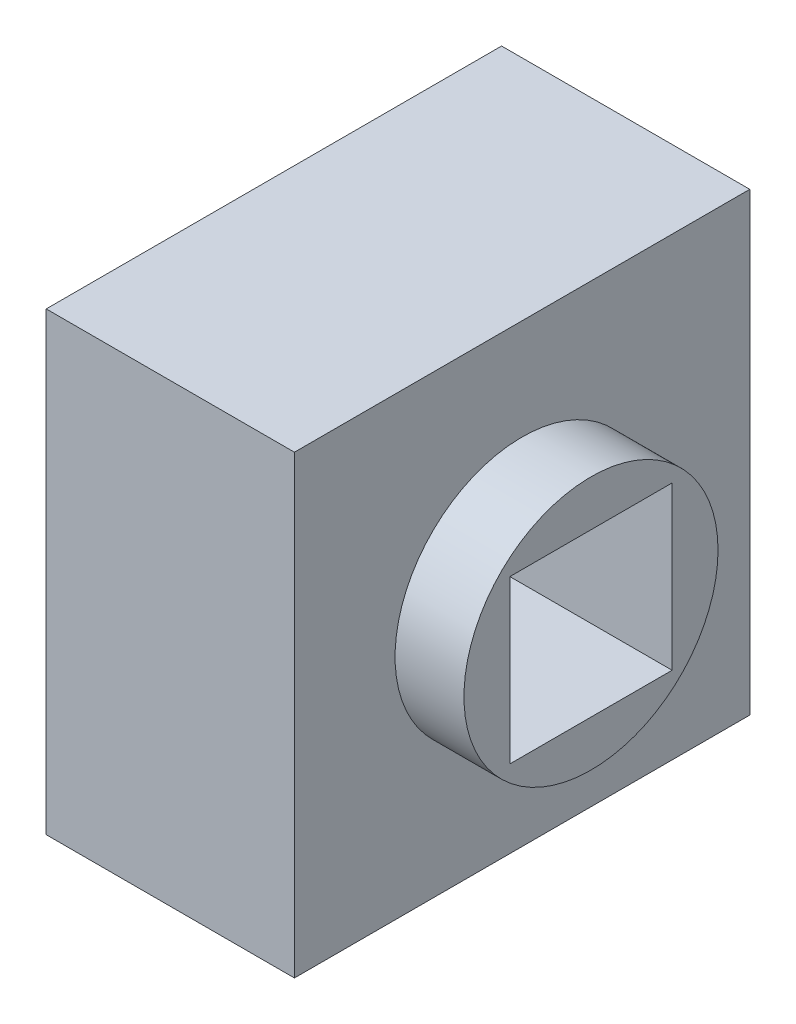
ISO-10303-21;
HEADER;
FILE_DESCRIPTION(('STEP AP214'),'2;1');
FILE_NAME('part.step','',(''),(''),'','','');
FILE_SCHEMA(('AUTOMOTIVE_DESIGN { 1 0 10303 214 1 1 1 1 }'));
ENDSEC;
DATA;
#1=APPLICATION_CONTEXT('core data for automotive mechanical design processes');
#2=APPLICATION_PROTOCOL_DEFINITION('international standard','automotive_design',2000,#1);
#3=PRODUCT_CONTEXT('',#1,'mechanical');
#4=PRODUCT('Part','Part','',(#3));
#5=PRODUCT_RELATED_PRODUCT_CATEGORY('part','',(#4));
#6=PRODUCT_DEFINITION_FORMATION('','',#4);
#7=PRODUCT_DEFINITION_CONTEXT('part definition',#1,'design');
#8=PRODUCT_DEFINITION('design','',#6,#7);
#9=PRODUCT_DEFINITION_SHAPE('','',#8);
#10=(LENGTH_UNIT() NAMED_UNIT(*) SI_UNIT(.MILLI.,.METRE.));
#11=(NAMED_UNIT(*) PLANE_ANGLE_UNIT() SI_UNIT($,.RADIAN.));
#12=(NAMED_UNIT(*) SI_UNIT($,.STERADIAN.) SOLID_ANGLE_UNIT());
#13=UNCERTAINTY_MEASURE_WITH_UNIT(LENGTH_MEASURE(1.E-05),#10,'distance_accuracy_value','');
#14=(GEOMETRIC_REPRESENTATION_CONTEXT(3) GLOBAL_UNCERTAINTY_ASSIGNED_CONTEXT((#13)) GLOBAL_UNIT_ASSIGNED_CONTEXT((#10,
#11,#12)) REPRESENTATION_CONTEXT('',''));
#15=CARTESIAN_POINT('',(0.,0.,0.));
#16=DIRECTION('',(0.,0.,1.));
#17=DIRECTION('',(1.,0.,0.));
#18=AXIS2_PLACEMENT_3D('',#15,#16,#17);
#19=CARTESIAN_POINT('',(12.7,0.,0.));
#20=DIRECTION('',(1.,0.,0.));
#21=DIRECTION('',(0.,0.,-1.));
#22=AXIS2_PLACEMENT_3D('',#19,#20,#21);
#23=PLANE('',#22);
#24=DIRECTION('',(0.,-1.,0.));
#25=VECTOR('',#24,1.);
#26=CARTESIAN_POINT('',(12.7,0.,7.5));
#27=LINE('',#26,#25);
#28=CARTESIAN_POINT('',(12.7,15.8,7.5));
#29=VERTEX_POINT('',#28);
#30=CARTESIAN_POINT('',(12.7,-7.5,7.5));
#31=VERTEX_POINT('',#30);
#32=EDGE_CURVE('E178',#29,#31,#27,.T.);
#33=ORIENTED_EDGE('',*,*,#32,.T.);
#34=DIRECTION('',(0.,0.,-1.));
#35=VECTOR('',#34,1.);
#36=CARTESIAN_POINT('',(12.7,-7.5,0.));
#37=LINE('',#36,#35);
#38=CARTESIAN_POINT('',(12.7,-7.5,-15.8));
#39=VERTEX_POINT('',#38);
#40=EDGE_CURVE('E109',#31,#39,#37,.T.);
#41=ORIENTED_EDGE('',*,*,#40,.T.);
#42=DIRECTION('',(0.,1.,0.));
#43=VECTOR('',#42,1.);
#44=CARTESIAN_POINT('',(12.7,0.,-15.8));
#45=LINE('',#44,#43);
#46=CARTESIAN_POINT('',(12.7,15.8,-15.8));
#47=VERTEX_POINT('',#46);
#48=EDGE_CURVE('E181',#39,#47,#45,.T.);
#49=ORIENTED_EDGE('',*,*,#48,.T.);
#50=DIRECTION('',(0.,0.,1.));
#51=VECTOR('',#50,1.);
#52=CARTESIAN_POINT('',(12.7,15.8,0.));
#53=LINE('',#52,#51);
#54=EDGE_CURVE('E81',#47,#29,#53,.T.);
#55=ORIENTED_EDGE('',*,*,#54,.T.);
#56=EDGE_LOOP('',(#33,#41,#49,#55));
#57=FACE_BOUND('',#56,.T.);
#58=CARTESIAN_POINT('',(12.7,4.15,-4.15));
#59=DIRECTION('',(1.,0.,0.));
#60=DIRECTION('',(0.,0.,-1.));
#61=AXIS2_PLACEMENT_3D('',#58,#59,#60);
#62=CIRCLE('',#61,6.5);
#63=CARTESIAN_POINT('',(12.7,4.15,-10.65));
#64=VERTEX_POINT('',#63);
#65=EDGE_CURVE('E160',#64,#64,#62,.T.);
#66=ORIENTED_EDGE('',*,*,#65,.F.);
#67=EDGE_LOOP('',(#66));
#68=FACE_BOUND('',#67,.T.);
#69=ADVANCED_FACE('F57',(#57,#68),#23,.T.);
#70=CARTESIAN_POINT('',(0.,0.,0.));
#71=DIRECTION('',(1.,0.,0.));
#72=DIRECTION('',(0.,0.,-1.));
#73=AXIS2_PLACEMENT_3D('',#70,#71,#72);
#74=PLANE('',#73);
#75=DIRECTION('',(0.,-1.,0.));
#76=VECTOR('',#75,1.);
#77=CARTESIAN_POINT('',(0.,0.,7.5));
#78=LINE('',#77,#76);
#79=CARTESIAN_POINT('',(0.,15.8,7.5));
#80=VERTEX_POINT('',#79);
#81=CARTESIAN_POINT('',(0.,-7.5,7.5));
#82=VERTEX_POINT('',#81);
#83=EDGE_CURVE('E177',#80,#82,#78,.T.);
#84=ORIENTED_EDGE('',*,*,#83,.F.);
#85=DIRECTION('',(0.,0.,1.));
#86=VECTOR('',#85,1.);
#87=CARTESIAN_POINT('',(0.,15.8,0.));
#88=LINE('',#87,#86);
#89=CARTESIAN_POINT('',(0.,15.8,-15.8));
#90=VERTEX_POINT('',#89);
#91=EDGE_CURVE('E102',#90,#80,#88,.T.);
#92=ORIENTED_EDGE('',*,*,#91,.F.);
#93=DIRECTION('',(0.,1.,0.));
#94=VECTOR('',#93,1.);
#95=CARTESIAN_POINT('',(0.,0.,-15.8));
#96=LINE('',#95,#94);
#97=CARTESIAN_POINT('',(0.,-7.5,-15.8));
#98=VERTEX_POINT('',#97);
#99=EDGE_CURVE('E189',#98,#90,#96,.T.);
#100=ORIENTED_EDGE('',*,*,#99,.F.);
#101=DIRECTION('',(0.,0.,-1.));
#102=VECTOR('',#101,1.);
#103=CARTESIAN_POINT('',(0.,-7.5,0.));
#104=LINE('',#103,#102);
#105=EDGE_CURVE('E187',#82,#98,#104,.T.);
#106=ORIENTED_EDGE('',*,*,#105,.F.);
#107=EDGE_LOOP('',(#84,#92,#100,#106));
#108=FACE_BOUND('',#107,.T.);
#109=DIRECTION('',(0.,-1.,0.));
#110=VECTOR('',#109,1.);
#111=CARTESIAN_POINT('',(0.,0.,0.));
#112=LINE('',#111,#110);
#113=CARTESIAN_POINT('',(0.,8.3,0.));
#114=VERTEX_POINT('',#113);
#115=CARTESIAN_POINT('',(0.,0.,0.));
#116=VERTEX_POINT('',#115);
#117=EDGE_CURVE('E72',#114,#116,#112,.T.);
#118=ORIENTED_EDGE('',*,*,#117,.T.);
#119=DIRECTION('',(0.,0.,-1.));
#120=VECTOR('',#119,1.);
#121=CARTESIAN_POINT('',(0.,0.,0.));
#122=LINE('',#121,#120);
#123=CARTESIAN_POINT('',(0.,0.,-8.3));
#124=VERTEX_POINT('',#123);
#125=EDGE_CURVE('E167',#116,#124,#122,.T.);
#126=ORIENTED_EDGE('',*,*,#125,.T.);
#127=DIRECTION('',(0.,1.,0.));
#128=VECTOR('',#127,1.);
#129=CARTESIAN_POINT('',(0.,0.,-8.3));
#130=LINE('',#129,#128);
#131=CARTESIAN_POINT('',(0.,8.3,-8.3));
#132=VERTEX_POINT('',#131);
#133=EDGE_CURVE('E139',#124,#132,#130,.T.);
#134=ORIENTED_EDGE('',*,*,#133,.T.);
#135=DIRECTION('',(0.,0.,1.));
#136=VECTOR('',#135,1.);
#137=CARTESIAN_POINT('',(0.,8.3,0.));
#138=LINE('',#137,#136);
#139=EDGE_CURVE('E170',#132,#114,#138,.T.);
#140=ORIENTED_EDGE('',*,*,#139,.T.);
#141=EDGE_LOOP('',(#118,#126,#134,#140));
#142=FACE_BOUND('',#141,.T.);
#143=ADVANCED_FACE('F202',(#108,#142),#74,.F.);
#144=CARTESIAN_POINT('',(12.7,0.,7.5));
#145=DIRECTION('',(0.,0.,-1.));
#146=DIRECTION('',(-1.,0.,0.));
#147=AXIS2_PLACEMENT_3D('',#144,#145,#146);
#148=PLANE('',#147);
#149=ORIENTED_EDGE('',*,*,#83,.T.);
#150=DIRECTION('',(-1.,0.,0.));
#151=VECTOR('',#150,1.);
#152=CARTESIAN_POINT('',(12.7,-7.5,7.5));
#153=LINE('',#152,#151);
#154=EDGE_CURVE('E12',#31,#82,#153,.T.);
#155=ORIENTED_EDGE('',*,*,#154,.F.);
#156=ORIENTED_EDGE('',*,*,#32,.F.);
#157=DIRECTION('',(-1.,0.,0.));
#158=VECTOR('',#157,1.);
#159=CARTESIAN_POINT('',(12.7,15.8,7.5));
#160=LINE('',#159,#158);
#161=EDGE_CURVE('E184',#29,#80,#160,.T.);
#162=ORIENTED_EDGE('',*,*,#161,.T.);
#163=EDGE_LOOP('',(#149,#155,#156,#162));
#164=FACE_BOUND('',#163,.T.);
#165=ADVANCED_FACE('F59',(#164),#148,.F.);
#166=CARTESIAN_POINT('',(12.7,-7.5,0.));
#167=DIRECTION('',(0.,1.,0.));
#168=DIRECTION('',(0.,0.,1.));
#169=AXIS2_PLACEMENT_3D('',#166,#167,#168);
#170=PLANE('',#169);
#171=ORIENTED_EDGE('',*,*,#105,.T.);
#172=DIRECTION('',(-1.,0.,0.));
#173=VECTOR('',#172,1.);
#174=CARTESIAN_POINT('',(12.7,-7.5,-15.8));
#175=LINE('',#174,#173);
#176=EDGE_CURVE('E65',#39,#98,#175,.T.);
#177=ORIENTED_EDGE('',*,*,#176,.F.);
#178=ORIENTED_EDGE('',*,*,#40,.F.);
#179=ORIENTED_EDGE('',*,*,#154,.T.);
#180=EDGE_LOOP('',(#171,#177,#178,#179));
#181=FACE_BOUND('',#180,.T.);
#182=ADVANCED_FACE('F216',(#181),#170,.F.);
#183=CARTESIAN_POINT('',(12.7,0.,-15.8));
#184=DIRECTION('',(0.,0.,1.));
#185=DIRECTION('',(1.,0.,0.));
#186=AXIS2_PLACEMENT_3D('',#183,#184,#185);
#187=PLANE('',#186);
#188=ORIENTED_EDGE('',*,*,#99,.T.);
#189=DIRECTION('',(-1.,0.,0.));
#190=VECTOR('',#189,1.);
#191=CARTESIAN_POINT('',(12.7,15.8,-15.8));
#192=LINE('',#191,#190);
#193=EDGE_CURVE('E193',#47,#90,#192,.T.);
#194=ORIENTED_EDGE('',*,*,#193,.F.);
#195=ORIENTED_EDGE('',*,*,#48,.F.);
#196=ORIENTED_EDGE('',*,*,#176,.T.);
#197=EDGE_LOOP('',(#188,#194,#195,#196));
#198=FACE_BOUND('',#197,.T.);
#199=ADVANCED_FACE('F198',(#198),#187,.F.);
#200=CARTESIAN_POINT('',(12.7,15.8,0.));
#201=DIRECTION('',(0.,-1.,0.));
#202=DIRECTION('',(0.,0.,-1.));
#203=AXIS2_PLACEMENT_3D('',#200,#201,#202);
#204=PLANE('',#203);
#205=ORIENTED_EDGE('',*,*,#91,.T.);
#206=ORIENTED_EDGE('',*,*,#161,.F.);
#207=ORIENTED_EDGE('',*,*,#54,.F.);
#208=ORIENTED_EDGE('',*,*,#193,.T.);
#209=EDGE_LOOP('',(#205,#206,#207,#208));
#210=FACE_BOUND('',#209,.T.);
#211=ADVANCED_FACE('F207',(#210),#204,.F.);
#212=CARTESIAN_POINT('',(12.7,0.,0.));
#213=DIRECTION('',(0.,0.,-1.));
#214=DIRECTION('',(-1.,0.,0.));
#215=AXIS2_PLACEMENT_3D('',#212,#213,#214);
#216=PLANE('',#215);
#217=ORIENTED_EDGE('',*,*,#117,.F.);
#218=DIRECTION('',(-1.,0.,0.));
#219=VECTOR('',#218,1.);
#220=CARTESIAN_POINT('',(12.7,8.3,0.));
#221=LINE('',#220,#219);
#222=CARTESIAN_POINT('',(16.225,8.3,0.));
#223=VERTEX_POINT('',#222);
#224=EDGE_CURVE('E173',#223,#114,#221,.T.);
#225=ORIENTED_EDGE('',*,*,#224,.F.);
#226=DIRECTION('',(0.,-1.,0.));
#227=VECTOR('',#226,1.);
#228=CARTESIAN_POINT('',(16.225,8.3,0.));
#229=LINE('',#228,#227);
#230=CARTESIAN_POINT('',(16.225,0.,0.));
#231=VERTEX_POINT('',#230);
#232=EDGE_CURVE('E156',#223,#231,#229,.T.);
#233=ORIENTED_EDGE('',*,*,#232,.T.);
#234=DIRECTION('',(-1.,0.,0.));
#235=VECTOR('',#234,1.);
#236=CARTESIAN_POINT('',(12.7,0.,0.));
#237=LINE('',#236,#235);
#238=EDGE_CURVE('E142',#231,#116,#237,.T.);
#239=ORIENTED_EDGE('',*,*,#238,.T.);
#240=EDGE_LOOP('',(#217,#225,#233,#239));
#241=FACE_BOUND('',#240,.T.);
#242=ADVANCED_FACE('F209',(#241),#216,.T.);
#243=CARTESIAN_POINT('',(12.7,0.,0.));
#244=DIRECTION('',(0.,1.,0.));
#245=DIRECTION('',(0.,0.,1.));
#246=AXIS2_PLACEMENT_3D('',#243,#244,#245);
#247=PLANE('',#246);
#248=ORIENTED_EDGE('',*,*,#125,.F.);
#249=ORIENTED_EDGE('',*,*,#238,.F.);
#250=DIRECTION('',(0.,0.,-1.));
#251=VECTOR('',#250,1.);
#252=CARTESIAN_POINT('',(16.225,0.,0.));
#253=LINE('',#252,#251);
#254=CARTESIAN_POINT('',(16.225,0.,-8.3));
#255=VERTEX_POINT('',#254);
#256=EDGE_CURVE('E146',#231,#255,#253,.T.);
#257=ORIENTED_EDGE('',*,*,#256,.T.);
#258=DIRECTION('',(-1.,0.,0.));
#259=VECTOR('',#258,1.);
#260=CARTESIAN_POINT('',(12.7,0.,-8.3));
#261=LINE('',#260,#259);
#262=EDGE_CURVE('E132',#255,#124,#261,.T.);
#263=ORIENTED_EDGE('',*,*,#262,.T.);
#264=EDGE_LOOP('',(#248,#249,#257,#263));
#265=FACE_BOUND('',#264,.T.);
#266=ADVANCED_FACE('F147',(#265),#247,.T.);
#267=CARTESIAN_POINT('',(12.7,0.,-8.3));
#268=DIRECTION('',(0.,0.,1.));
#269=DIRECTION('',(1.,0.,0.));
#270=AXIS2_PLACEMENT_3D('',#267,#268,#269);
#271=PLANE('',#270);
#272=ORIENTED_EDGE('',*,*,#133,.F.);
#273=ORIENTED_EDGE('',*,*,#262,.F.);
#274=DIRECTION('',(0.,1.,0.));
#275=VECTOR('',#274,1.);
#276=CARTESIAN_POINT('',(16.225,8.3,-8.3));
#277=LINE('',#276,#275);
#278=CARTESIAN_POINT('',(16.225,8.3,-8.3));
#279=VERTEX_POINT('',#278);
#280=EDGE_CURVE('E136',#255,#279,#277,.T.);
#281=ORIENTED_EDGE('',*,*,#280,.T.);
#282=DIRECTION('',(-1.,0.,0.));
#283=VECTOR('',#282,1.);
#284=CARTESIAN_POINT('',(12.7,8.3,-8.3));
#285=LINE('',#284,#283);
#286=EDGE_CURVE('E143',#279,#132,#285,.T.);
#287=ORIENTED_EDGE('',*,*,#286,.T.);
#288=EDGE_LOOP('',(#272,#273,#281,#287));
#289=FACE_BOUND('',#288,.T.);
#290=ADVANCED_FACE('F134',(#289),#271,.T.);
#291=CARTESIAN_POINT('',(12.7,8.3,0.));
#292=DIRECTION('',(0.,-1.,0.));
#293=DIRECTION('',(0.,0.,-1.));
#294=AXIS2_PLACEMENT_3D('',#291,#292,#293);
#295=PLANE('',#294);
#296=ORIENTED_EDGE('',*,*,#139,.F.);
#297=ORIENTED_EDGE('',*,*,#286,.F.);
#298=DIRECTION('',(0.,0.,1.));
#299=VECTOR('',#298,1.);
#300=CARTESIAN_POINT('',(16.225,8.3,0.));
#301=LINE('',#300,#299);
#302=EDGE_CURVE('E154',#279,#223,#301,.T.);
#303=ORIENTED_EDGE('',*,*,#302,.T.);
#304=ORIENTED_EDGE('',*,*,#224,.T.);
#305=EDGE_LOOP('',(#296,#297,#303,#304));
#306=FACE_BOUND('',#305,.T.);
#307=ADVANCED_FACE('F230',(#306),#295,.T.);
#308=CARTESIAN_POINT('',(16.225,4.15,-4.15));
#309=DIRECTION('',(1.,0.,0.));
#310=DIRECTION('',(0.,0.,-1.));
#311=AXIS2_PLACEMENT_3D('',#308,#309,#310);
#312=PLANE('',#311);
#313=CARTESIAN_POINT('',(16.225,4.15,-4.15));
#314=DIRECTION('',(1.,0.,0.));
#315=DIRECTION('',(0.,0.,-1.));
#316=AXIS2_PLACEMENT_3D('',#313,#314,#315);
#317=CIRCLE('',#316,6.5);
#318=CARTESIAN_POINT('',(16.225,4.15,-10.65));
#319=VERTEX_POINT('',#318);
#320=EDGE_CURVE('E161',#319,#319,#317,.T.);
#321=ORIENTED_EDGE('',*,*,#320,.T.);
#322=EDGE_LOOP('',(#321));
#323=FACE_BOUND('',#322,.T.);
#324=ORIENTED_EDGE('',*,*,#280,.F.);
#325=ORIENTED_EDGE('',*,*,#256,.F.);
#326=ORIENTED_EDGE('',*,*,#232,.F.);
#327=ORIENTED_EDGE('',*,*,#302,.F.);
#328=EDGE_LOOP('',(#324,#325,#326,#327));
#329=FACE_BOUND('',#328,.T.);
#330=ADVANCED_FACE('F152',(#323,#329),#312,.T.);
#331=CARTESIAN_POINT('',(16.225,4.15,-4.15));
#332=DIRECTION('',(-1.,0.,0.));
#333=DIRECTION('',(0.,0.,1.));
#334=AXIS2_PLACEMENT_3D('',#331,#332,#333);
#335=CYLINDRICAL_SURFACE('',#334,6.5);
#336=ORIENTED_EDGE('',*,*,#320,.F.);
#337=EDGE_LOOP('',(#336));
#338=FACE_BOUND('',#337,.T.);
#339=ORIENTED_EDGE('',*,*,#65,.T.);
#340=EDGE_LOOP('',(#339));
#341=FACE_BOUND('',#340,.T.);
#342=ADVANCED_FACE('F234',(#338,#341),#335,.T.);
#343=CLOSED_SHELL('',(#69,#143,#165,#182,#199,#211,#242,#266,#290,#307,#330,#342));
#344=MANIFOLD_SOLID_BREP('B2',#343);
#345=ADVANCED_BREP_SHAPE_REPRESENTATION('',(#18,#344),#14);
#346=SHAPE_DEFINITION_REPRESENTATION(#9,#345);
ENDSEC;
END-ISO-10303-21;
